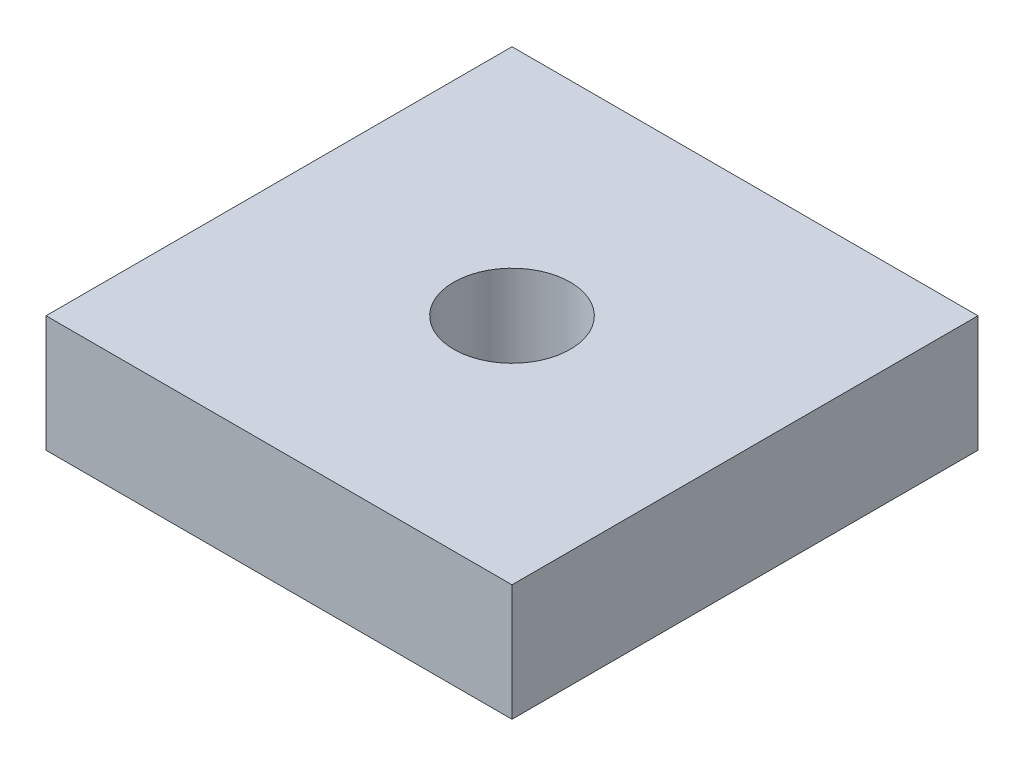
ISO-10303-21;
HEADER;
FILE_DESCRIPTION(('STEP AP214'),'2;1');
FILE_NAME('part.step','',(''),(''),'','','');
FILE_SCHEMA(('AUTOMOTIVE_DESIGN { 1 0 10303 214 1 1 1 1 }'));
ENDSEC;
DATA;
#1=APPLICATION_CONTEXT('core data for automotive mechanical design processes');
#2=APPLICATION_PROTOCOL_DEFINITION('international standard','automotive_design',2000,#1);
#3=PRODUCT_CONTEXT('',#1,'mechanical');
#4=PRODUCT('Part','Part','',(#3));
#5=PRODUCT_RELATED_PRODUCT_CATEGORY('part','',(#4));
#6=PRODUCT_DEFINITION_FORMATION('','',#4);
#7=PRODUCT_DEFINITION_CONTEXT('part definition',#1,'design');
#8=PRODUCT_DEFINITION('design','',#6,#7);
#9=PRODUCT_DEFINITION_SHAPE('','',#8);
#10=(LENGTH_UNIT() NAMED_UNIT(*) SI_UNIT(.MILLI.,.METRE.));
#11=(NAMED_UNIT(*) PLANE_ANGLE_UNIT() SI_UNIT($,.RADIAN.));
#12=(NAMED_UNIT(*) SI_UNIT($,.STERADIAN.) SOLID_ANGLE_UNIT());
#13=UNCERTAINTY_MEASURE_WITH_UNIT(LENGTH_MEASURE(1.E-05),#10,'distance_accuracy_value','');
#14=(GEOMETRIC_REPRESENTATION_CONTEXT(3) GLOBAL_UNCERTAINTY_ASSIGNED_CONTEXT((#13)) GLOBAL_UNIT_ASSIGNED_CONTEXT((#10,
#11,#12)) REPRESENTATION_CONTEXT('',''));
#15=CARTESIAN_POINT('',(0.,0.,0.));
#16=DIRECTION('',(0.,0.,1.));
#17=DIRECTION('',(1.,0.,0.));
#18=AXIS2_PLACEMENT_3D('',#15,#16,#17);
#19=CARTESIAN_POINT('',(12.7,0.,12.7));
#20=DIRECTION('',(0.,1.,0.));
#21=DIRECTION('',(1.,0.,0.));
#22=AXIS2_PLACEMENT_3D('',#19,#20,#21);
#23=PLANE('',#22);
#24=CARTESIAN_POINT('',(12.7,0.,12.7));
#25=DIRECTION('',(0.,-1.,0.));
#26=DIRECTION('',(1.,0.,0.));
#27=AXIS2_PLACEMENT_3D('',#24,#25,#26);
#28=CIRCLE('',#27,3.175);
#29=CARTESIAN_POINT('',(9.525,0.,12.7));
#30=VERTEX_POINT('',#29);
#31=EDGE_CURVE('E20',#30,#30,#28,.T.);
#32=ORIENTED_EDGE('',*,*,#31,.F.);
#33=EDGE_LOOP('',(#32));
#34=FACE_BOUND('',#33,.T.);
#35=DIRECTION('',(-1.,0.,0.));
#36=VECTOR('',#35,1.);
#37=CARTESIAN_POINT('',(25.4,0.,25.4));
#38=LINE('',#37,#36);
#39=CARTESIAN_POINT('',(25.4,0.,25.4));
#40=VERTEX_POINT('',#39);
#41=CARTESIAN_POINT('',(0.,0.,25.4));
#42=VERTEX_POINT('',#41);
#43=EDGE_CURVE('E27',#40,#42,#38,.T.);
#44=ORIENTED_EDGE('',*,*,#43,.T.);
#45=DIRECTION('',(0.,0.,-1.));
#46=VECTOR('',#45,1.);
#47=CARTESIAN_POINT('',(0.,0.,25.4));
#48=LINE('',#47,#46);
#49=CARTESIAN_POINT('',(0.,0.,0.));
#50=VERTEX_POINT('',#49);
#51=EDGE_CURVE('E115',#42,#50,#48,.T.);
#52=ORIENTED_EDGE('',*,*,#51,.T.);
#53=DIRECTION('',(1.,0.,0.));
#54=VECTOR('',#53,1.);
#55=CARTESIAN_POINT('',(0.,0.,0.));
#56=LINE('',#55,#54);
#57=CARTESIAN_POINT('',(25.4,0.,0.));
#58=VERTEX_POINT('',#57);
#59=EDGE_CURVE('E106',#50,#58,#56,.T.);
#60=ORIENTED_EDGE('',*,*,#59,.T.);
#61=DIRECTION('',(0.,0.,1.));
#62=VECTOR('',#61,1.);
#63=CARTESIAN_POINT('',(25.4,0.,0.));
#64=LINE('',#63,#62);
#65=EDGE_CURVE('E83',#58,#40,#64,.T.);
#66=ORIENTED_EDGE('',*,*,#65,.T.);
#67=EDGE_LOOP('',(#44,#52,#60,#66));
#68=FACE_BOUND('',#67,.T.);
#69=ADVANCED_FACE('F16',(#34,#68),#23,.F.);
#70=CARTESIAN_POINT('',(12.7,6.35,12.7));
#71=DIRECTION('',(0.,1.,0.));
#72=DIRECTION('',(1.,0.,0.));
#73=AXIS2_PLACEMENT_3D('',#70,#71,#72);
#74=PLANE('',#73);
#75=CARTESIAN_POINT('',(12.7,6.35,12.7));
#76=DIRECTION('',(0.,-1.,0.));
#77=DIRECTION('',(1.,0.,0.));
#78=AXIS2_PLACEMENT_3D('',#75,#76,#77);
#79=CIRCLE('',#78,3.175);
#80=CARTESIAN_POINT('',(9.525,6.35,12.7));
#81=VERTEX_POINT('',#80);
#82=EDGE_CURVE('E137',#81,#81,#79,.T.);
#83=ORIENTED_EDGE('',*,*,#82,.T.);
#84=EDGE_LOOP('',(#83));
#85=FACE_BOUND('',#84,.T.);
#86=DIRECTION('',(1.,0.,0.));
#87=VECTOR('',#86,1.);
#88=CARTESIAN_POINT('',(25.4,6.35,25.4));
#89=LINE('',#88,#87);
#90=CARTESIAN_POINT('',(0.,6.35,25.4));
#91=VERTEX_POINT('',#90);
#92=CARTESIAN_POINT('',(25.4,6.35,25.4));
#93=VERTEX_POINT('',#92);
#94=EDGE_CURVE('E11',#91,#93,#89,.T.);
#95=ORIENTED_EDGE('',*,*,#94,.T.);
#96=DIRECTION('',(0.,0.,-1.));
#97=VECTOR('',#96,1.);
#98=CARTESIAN_POINT('',(25.4,6.35,0.));
#99=LINE('',#98,#97);
#100=CARTESIAN_POINT('',(25.4,6.35,0.));
#101=VERTEX_POINT('',#100);
#102=EDGE_CURVE('E87',#93,#101,#99,.T.);
#103=ORIENTED_EDGE('',*,*,#102,.T.);
#104=DIRECTION('',(-1.,0.,0.));
#105=VECTOR('',#104,1.);
#106=CARTESIAN_POINT('',(0.,6.35,0.));
#107=LINE('',#106,#105);
#108=CARTESIAN_POINT('',(0.,6.35,0.));
#109=VERTEX_POINT('',#108);
#110=EDGE_CURVE('E90',#101,#109,#107,.T.);
#111=ORIENTED_EDGE('',*,*,#110,.T.);
#112=DIRECTION('',(0.,0.,1.));
#113=VECTOR('',#112,1.);
#114=CARTESIAN_POINT('',(0.,6.35,25.4));
#115=LINE('',#114,#113);
#116=EDGE_CURVE('E128',#109,#91,#115,.T.);
#117=ORIENTED_EDGE('',*,*,#116,.T.);
#118=EDGE_LOOP('',(#95,#103,#111,#117));
#119=FACE_BOUND('',#118,.T.);
#120=ADVANCED_FACE('F88',(#85,#119),#74,.T.);
#121=CARTESIAN_POINT('',(0.,0.,25.4));
#122=DIRECTION('',(0.,0.,1.));
#123=DIRECTION('',(1.,0.,0.));
#124=AXIS2_PLACEMENT_3D('',#121,#122,#123);
#125=PLANE('',#124);
#126=ORIENTED_EDGE('',*,*,#43,.F.);
#127=DIRECTION('',(0.,1.,0.));
#128=VECTOR('',#127,1.);
#129=CARTESIAN_POINT('',(25.4,0.,25.4));
#130=LINE('',#129,#128);
#131=EDGE_CURVE('E93',#40,#93,#130,.T.);
#132=ORIENTED_EDGE('',*,*,#131,.T.);
#133=ORIENTED_EDGE('',*,*,#94,.F.);
#134=DIRECTION('',(0.,1.,0.));
#135=VECTOR('',#134,1.);
#136=CARTESIAN_POINT('',(0.,0.,25.4));
#137=LINE('',#136,#135);
#138=EDGE_CURVE('E118',#42,#91,#137,.T.);
#139=ORIENTED_EDGE('',*,*,#138,.F.);
#140=EDGE_LOOP('',(#126,#132,#133,#139));
#141=FACE_BOUND('',#140,.T.);
#142=ADVANCED_FACE('F177',(#141),#125,.T.);
#143=CARTESIAN_POINT('',(25.4,0.,25.4));
#144=DIRECTION('',(1.,0.,0.));
#145=DIRECTION('',(0.,1.,0.));
#146=AXIS2_PLACEMENT_3D('',#143,#144,#145);
#147=PLANE('',#146);
#148=ORIENTED_EDGE('',*,*,#65,.F.);
#149=DIRECTION('',(0.,1.,0.));
#150=VECTOR('',#149,1.);
#151=CARTESIAN_POINT('',(25.4,0.,0.));
#152=LINE('',#151,#150);
#153=EDGE_CURVE('E95',#58,#101,#152,.T.);
#154=ORIENTED_EDGE('',*,*,#153,.T.);
#155=ORIENTED_EDGE('',*,*,#102,.F.);
#156=ORIENTED_EDGE('',*,*,#131,.F.);
#157=EDGE_LOOP('',(#148,#154,#155,#156));
#158=FACE_BOUND('',#157,.T.);
#159=ADVANCED_FACE('F96',(#158),#147,.T.);
#160=CARTESIAN_POINT('',(25.4,0.,0.));
#161=DIRECTION('',(0.,0.,-1.));
#162=DIRECTION('',(-1.,0.,0.));
#163=AXIS2_PLACEMENT_3D('',#160,#161,#162);
#164=PLANE('',#163);
#165=ORIENTED_EDGE('',*,*,#59,.F.);
#166=DIRECTION('',(0.,1.,0.));
#167=VECTOR('',#166,1.);
#168=CARTESIAN_POINT('',(0.,0.,0.));
#169=LINE('',#168,#167);
#170=EDGE_CURVE('E103',#50,#109,#169,.T.);
#171=ORIENTED_EDGE('',*,*,#170,.T.);
#172=ORIENTED_EDGE('',*,*,#110,.F.);
#173=ORIENTED_EDGE('',*,*,#153,.F.);
#174=EDGE_LOOP('',(#165,#171,#172,#173));
#175=FACE_BOUND('',#174,.T.);
#176=ADVANCED_FACE('F101',(#175),#164,.T.);
#177=CARTESIAN_POINT('',(0.,0.,0.));
#178=DIRECTION('',(-1.,0.,0.));
#179=DIRECTION('',(0.,0.,1.));
#180=AXIS2_PLACEMENT_3D('',#177,#178,#179);
#181=PLANE('',#180);
#182=ORIENTED_EDGE('',*,*,#51,.F.);
#183=ORIENTED_EDGE('',*,*,#138,.T.);
#184=ORIENTED_EDGE('',*,*,#116,.F.);
#185=ORIENTED_EDGE('',*,*,#170,.F.);
#186=EDGE_LOOP('',(#182,#183,#184,#185));
#187=FACE_BOUND('',#186,.T.);
#188=ADVANCED_FACE('F126',(#187),#181,.T.);
#189=CARTESIAN_POINT('',(12.7,0.,12.7));
#190=DIRECTION('',(0.,1.,0.));
#191=DIRECTION('',(1.,0.,0.));
#192=AXIS2_PLACEMENT_3D('',#189,#190,#191);
#193=CYLINDRICAL_SURFACE('',#192,3.175);
#194=ORIENTED_EDGE('',*,*,#82,.F.);
#195=DIRECTION('',(0.,-1.,0.));
#196=VECTOR('',#195,1.);
#197=CARTESIAN_POINT('',(9.525,0.,12.7));
#198=LINE('',#197,#196);
#199=EDGE_CURVE('E62',#81,#30,#198,.T.);
#200=ORIENTED_EDGE('',*,*,#199,.T.);
#201=ORIENTED_EDGE('',*,*,#31,.T.);
#202=ORIENTED_EDGE('',*,*,#199,.F.);
#203=EDGE_LOOP('',(#194,#200,#201,#202));
#204=FACE_BOUND('',#203,.T.);
#205=ADVANCED_FACE('F18',(#204),#193,.F.);
#206=CLOSED_SHELL('',(#69,#120,#142,#159,#176,#188,#205));
#207=MANIFOLD_SOLID_BREP('B1',#206);
#208=ADVANCED_BREP_SHAPE_REPRESENTATION('',(#18,#207),#14);
#209=SHAPE_DEFINITION_REPRESENTATION(#9,#208);
ENDSEC;
END-ISO-10303-21;
